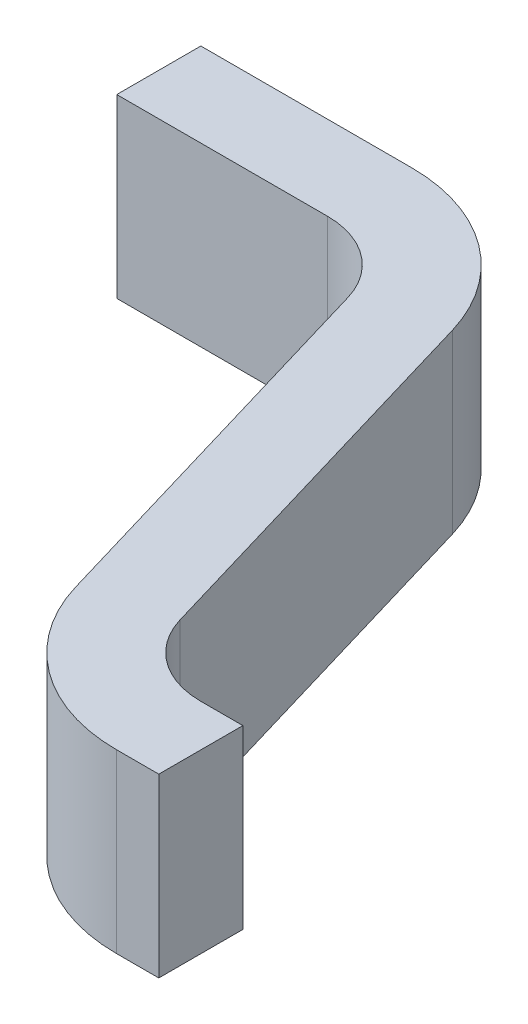
ISO-10303-21;
HEADER;
FILE_DESCRIPTION(('STEP AP214'),'2;1');
FILE_NAME('part.step','',(''),(''),'','','');
FILE_SCHEMA(('AUTOMOTIVE_DESIGN { 1 0 10303 214 1 1 1 1 }'));
ENDSEC;
DATA;
#1=APPLICATION_CONTEXT('core data for automotive mechanical design processes');
#2=APPLICATION_PROTOCOL_DEFINITION('international standard','automotive_design',2000,#1);
#3=PRODUCT_CONTEXT('',#1,'mechanical');
#4=PRODUCT('Part','Part','',(#3));
#5=PRODUCT_RELATED_PRODUCT_CATEGORY('part','',(#4));
#6=PRODUCT_DEFINITION_FORMATION('','',#4);
#7=PRODUCT_DEFINITION_CONTEXT('part definition',#1,'design');
#8=PRODUCT_DEFINITION('design','',#6,#7);
#9=PRODUCT_DEFINITION_SHAPE('','',#8);
#10=(LENGTH_UNIT() NAMED_UNIT(*) SI_UNIT(.MILLI.,.METRE.));
#11=(NAMED_UNIT(*) PLANE_ANGLE_UNIT() SI_UNIT($,.RADIAN.));
#12=(NAMED_UNIT(*) SI_UNIT($,.STERADIAN.) SOLID_ANGLE_UNIT());
#13=UNCERTAINTY_MEASURE_WITH_UNIT(LENGTH_MEASURE(1.E-05),#10,'distance_accuracy_value','');
#14=(GEOMETRIC_REPRESENTATION_CONTEXT(3) GLOBAL_UNCERTAINTY_ASSIGNED_CONTEXT((#13)) GLOBAL_UNIT_ASSIGNED_CONTEXT((#10,
#11,#12)) REPRESENTATION_CONTEXT('',''));
#15=CARTESIAN_POINT('',(0.,0.,0.));
#16=DIRECTION('',(0.,0.,1.));
#17=DIRECTION('',(1.,0.,0.));
#18=AXIS2_PLACEMENT_3D('',#15,#16,#17);
#19=CARTESIAN_POINT('',(-4.400000005961,4.235000006557,0.));
#20=DIRECTION('',(0.,-1.,0.));
#21=DIRECTION('',(0.,0.,-1.));
#22=AXIS2_PLACEMENT_3D('',#19,#20,#21);
#23=PLANE('',#22);
#24=DIRECTION('',(1.,0.,0.));
#25=VECTOR('',#24,1.);
#26=CARTESIAN_POINT('',(-4.150000005961,4.235000006557,1.35));
#27=LINE('',#26,#25);
#28=CARTESIAN_POINT('',(-3.850765250213,4.235000006557,1.35));
#29=VERTEX_POINT('',#28);
#30=CARTESIAN_POINT('',(-3.750000000001,4.235000006557,1.35));
#31=VERTEX_POINT('',#30);
#32=EDGE_CURVE('E128',#29,#31,#27,.T.);
#33=ORIENTED_EDGE('',*,*,#32,.T.);
#34=DIRECTION('',(0.,0.,-1.));
#35=VECTOR('',#34,1.);
#36=CARTESIAN_POINT('',(-3.750000000001,4.235000006557,1.35));
#37=LINE('',#36,#35);
#38=CARTESIAN_POINT('',(-3.750000000001,4.235000006557,1.55000000298));
#39=VERTEX_POINT('',#38);
#40=EDGE_CURVE('E132',#39,#31,#37,.T.);
#41=ORIENTED_EDGE('',*,*,#40,.F.);
#42=DIRECTION('',(1.,0.,0.));
#43=VECTOR('',#42,1.);
#44=CARTESIAN_POINT('',(-4.150000005961,4.235000006557,1.55000000298));
#45=LINE('',#44,#43);
#46=CARTESIAN_POINT('',(-3.850765252438,4.235000006557,1.55000000298));
#47=VERTEX_POINT('',#46);
#48=EDGE_CURVE('E135',#47,#39,#45,.T.);
#49=ORIENTED_EDGE('',*,*,#48,.F.);
#50=CARTESIAN_POINT('',(-3.850765252438,4.235000006557,1.15000000298));
#51=DIRECTION('',(0.,1.,0.));
#52=DIRECTION('',(1.,0.,0.));
#53=AXIS2_PLACEMENT_3D('',#50,#51,#52);
#54=CIRCLE('',#53,0.4);
#55=CARTESIAN_POINT('',(-4.23429319364,4.235000006557,1.263605981335));
#56=VERTEX_POINT('',#55);
#57=EDGE_CURVE('E158',#56,#47,#54,.T.);
#58=ORIENTED_EDGE('',*,*,#57,.F.);
#59=DIRECTION('',(0.284014945887016,0.,0.958819853003053));
#60=VECTOR('',#59,1.);
#61=CARTESIAN_POINT('',(-4.591763979419,4.235000006557,0.0568029900239));
#62=LINE('',#61,#60);
#63=CARTESIAN_POINT('',(-4.506930334275,4.235000006557,0.343197013803));
#64=VERTEX_POINT('',#63);
#65=EDGE_CURVE('E162',#64,#56,#62,.T.);
#66=ORIENTED_EDGE('',*,*,#65,.F.);
#67=CARTESIAN_POINT('',(-4.698694304876,4.235000006557,0.40000000298));
#68=DIRECTION('',(0.,1.,0.));
#69=DIRECTION('',(-1.,0.,0.));
#70=AXIS2_PLACEMENT_3D('',#67,#68,#69);
#71=CIRCLE('',#70,0.2);
#72=CARTESIAN_POINT('',(-4.698694304876,4.235000006557,0.20000000298));
#73=VERTEX_POINT('',#72);
#74=EDGE_CURVE('E11',#64,#73,#71,.T.);
#75=ORIENTED_EDGE('',*,*,#74,.T.);
#76=DIRECTION('',(1.,0.,0.));
#77=VECTOR('',#76,1.);
#78=CARTESIAN_POINT('',(-5.20000000596,4.235000006557,0.20000000298));
#79=LINE('',#78,#77);
#80=CARTESIAN_POINT('',(-5.20000000596,4.235000006557,0.20000000298));
#81=VERTEX_POINT('',#80);
#82=EDGE_CURVE('E187',#81,#73,#79,.T.);
#83=ORIENTED_EDGE('',*,*,#82,.F.);
#84=DIRECTION('',(0.,0.,-1.));
#85=VECTOR('',#84,1.);
#86=CARTESIAN_POINT('',(-5.20000000596,4.235000006557,0.));
#87=LINE('',#86,#85);
#88=CARTESIAN_POINT('',(-5.20000000596,4.235000006557,0.));
#89=VERTEX_POINT('',#88);
#90=EDGE_CURVE('E181',#81,#89,#87,.T.);
#91=ORIENTED_EDGE('',*,*,#90,.T.);
#92=DIRECTION('',(1.,0.,0.));
#93=VECTOR('',#92,1.);
#94=CARTESIAN_POINT('',(-5.20000000596,4.235000006557,0.));
#95=LINE('',#94,#93);
#96=CARTESIAN_POINT('',(-4.698694302651,4.235000006557,0.));
#97=VERTEX_POINT('',#96);
#98=EDGE_CURVE('E182',#89,#97,#95,.T.);
#99=ORIENTED_EDGE('',*,*,#98,.T.);
#100=CARTESIAN_POINT('',(-4.698694302651,4.235000006557,0.4));
#101=DIRECTION('',(0.,1.,0.));
#102=DIRECTION('',(1.,0.,0.));
#103=AXIS2_PLACEMENT_3D('',#100,#101,#102);
#104=CIRCLE('',#103,0.4);
#105=CARTESIAN_POINT('',(-4.315166361449,4.235000006557,0.286394021645));
#106=VERTEX_POINT('',#105);
#107=EDGE_CURVE('E208',#106,#97,#104,.T.);
#108=ORIENTED_EDGE('',*,*,#107,.F.);
#109=DIRECTION('',(0.284014945887016,0.,0.958819853003053));
#110=VECTOR('',#109,1.);
#111=CARTESIAN_POINT('',(-4.400000005961,4.235000006557,0.));
#112=LINE('',#111,#110);
#113=CARTESIAN_POINT('',(-4.042529220814,4.235000006557,1.206802989177));
#114=VERTEX_POINT('',#113);
#115=EDGE_CURVE('E20',#106,#114,#112,.T.);
#116=ORIENTED_EDGE('',*,*,#115,.T.);
#117=CARTESIAN_POINT('',(-3.850765250213,4.235000006557,1.15));
#118=DIRECTION('',(0.,1.,0.));
#119=DIRECTION('',(1.,0.,0.));
#120=AXIS2_PLACEMENT_3D('',#117,#118,#119);
#121=CIRCLE('',#120,0.2);
#122=EDGE_CURVE('E312',#114,#29,#121,.T.);
#123=ORIENTED_EDGE('',*,*,#122,.T.);
#124=EDGE_LOOP('',(#33,#41,#49,#58,#66,#75,#83,#91,#99,#108,#116,#123));
#125=FACE_BOUND('',#124,.T.);
#126=ADVANCED_FACE('F16',(#125),#23,.T.);
#127=CARTESIAN_POINT('',(-4.698694304876,4.654999993444,0.40000000298));
#128=DIRECTION('',(0.,1.,0.));
#129=DIRECTION('',(-1.,0.,0.));
#130=AXIS2_PLACEMENT_3D('',#127,#128,#129);
#131=CYLINDRICAL_SURFACE('',#130,0.2);
#132=DIRECTION('',(0.,1.,0.));
#133=VECTOR('',#132,1.);
#134=CARTESIAN_POINT('',(-4.698694304876,4.654999993444,0.20000000298));
#135=LINE('',#134,#133);
#136=CARTESIAN_POINT('',(-4.698694304876,4.654999993444,0.20000000298));
#137=VERTEX_POINT('',#136);
#138=EDGE_CURVE('E27',#73,#137,#135,.T.);
#139=ORIENTED_EDGE('',*,*,#138,.F.);
#140=ORIENTED_EDGE('',*,*,#74,.F.);
#141=DIRECTION('',(0.,-1.,0.));
#142=VECTOR('',#141,1.);
#143=CARTESIAN_POINT('',(-4.506930334275,4.654999993444,0.343197013803));
#144=LINE('',#143,#142);
#145=CARTESIAN_POINT('',(-4.506930334275,4.654999993444,0.343197013803));
#146=VERTEX_POINT('',#145);
#147=EDGE_CURVE('E191',#146,#64,#144,.T.);
#148=ORIENTED_EDGE('',*,*,#147,.F.);
#149=CARTESIAN_POINT('',(-4.698694304876,4.654999993444,0.40000000298));
#150=DIRECTION('',(0.,1.,0.));
#151=DIRECTION('',(-1.,0.,0.));
#152=AXIS2_PLACEMENT_3D('',#149,#150,#151);
#153=CIRCLE('',#152,0.2);
#154=EDGE_CURVE('E192',#146,#137,#153,.T.);
#155=ORIENTED_EDGE('',*,*,#154,.T.);
#156=EDGE_LOOP('',(#139,#140,#148,#155));
#157=FACE_BOUND('',#156,.T.);
#158=ADVANCED_FACE('F463',(#157),#131,.F.);
#159=CARTESIAN_POINT('',(-5.20000000596,4.654999993444,0.20000000298));
#160=DIRECTION('',(0.,0.,1.));
#161=DIRECTION('',(1.,0.,0.));
#162=AXIS2_PLACEMENT_3D('',#159,#160,#161);
#163=PLANE('',#162);
#164=DIRECTION('',(-1.,0.,0.));
#165=VECTOR('',#164,1.);
#166=CARTESIAN_POINT('',(-4.400000005961,4.654999993444,0.20000000298));
#167=LINE('',#166,#165);
#168=CARTESIAN_POINT('',(-5.20000000596,4.654999993444,0.20000000298));
#169=VERTEX_POINT('',#168);
#170=EDGE_CURVE('E175',#137,#169,#167,.T.);
#171=ORIENTED_EDGE('',*,*,#170,.T.);
#172=DIRECTION('',(0.,-1.,0.));
#173=VECTOR('',#172,1.);
#174=CARTESIAN_POINT('',(-5.20000000596,4.654999993444,0.20000000298));
#175=LINE('',#174,#173);
#176=EDGE_CURVE('E183',#169,#81,#175,.T.);
#177=ORIENTED_EDGE('',*,*,#176,.T.);
#178=ORIENTED_EDGE('',*,*,#82,.T.);
#179=ORIENTED_EDGE('',*,*,#138,.T.);
#180=EDGE_LOOP('',(#171,#177,#178,#179));
#181=FACE_BOUND('',#180,.T.);
#182=ADVANCED_FACE('F413',(#181),#163,.T.);
#183=CARTESIAN_POINT('',(-5.20000000596,4.654999993444,0.));
#184=DIRECTION('',(1.,0.,0.));
#185=DIRECTION('',(0.,1.,0.));
#186=AXIS2_PLACEMENT_3D('',#183,#184,#185);
#187=PLANE('',#186);
#188=DIRECTION('',(0.,0.,-1.));
#189=VECTOR('',#188,1.);
#190=CARTESIAN_POINT('',(-5.20000000596,4.654999993444,0.));
#191=LINE('',#190,#189);
#192=CARTESIAN_POINT('',(-5.20000000596,4.654999993444,0.));
#193=VERTEX_POINT('',#192);
#194=EDGE_CURVE('E167',#169,#193,#191,.T.);
#195=ORIENTED_EDGE('',*,*,#194,.T.);
#196=DIRECTION('',(0.,-1.,0.));
#197=VECTOR('',#196,1.);
#198=CARTESIAN_POINT('',(-5.20000000596,4.654999993444,0.));
#199=LINE('',#198,#197);
#200=EDGE_CURVE('E177',#193,#89,#199,.T.);
#201=ORIENTED_EDGE('',*,*,#200,.T.);
#202=ORIENTED_EDGE('',*,*,#90,.F.);
#203=ORIENTED_EDGE('',*,*,#176,.F.);
#204=EDGE_LOOP('',(#195,#201,#202,#203));
#205=FACE_BOUND('',#204,.T.);
#206=ADVANCED_FACE('F18',(#205),#187,.F.);
#207=CARTESIAN_POINT('',(-5.20000000596,4.654999993444,0.));
#208=DIRECTION('',(0.,0.,1.));
#209=DIRECTION('',(1.,0.,0.));
#210=AXIS2_PLACEMENT_3D('',#207,#208,#209);
#211=PLANE('',#210);
#212=DIRECTION('',(0.,1.,0.));
#213=VECTOR('',#212,1.);
#214=CARTESIAN_POINT('',(-4.698694302651,4.654999993444,0.));
#215=LINE('',#214,#213);
#216=CARTESIAN_POINT('',(-4.698694302651,4.654999993444,0.));
#217=VERTEX_POINT('',#216);
#218=EDGE_CURVE('E224',#97,#217,#215,.T.);
#219=ORIENTED_EDGE('',*,*,#218,.F.);
#220=ORIENTED_EDGE('',*,*,#98,.F.);
#221=ORIENTED_EDGE('',*,*,#200,.F.);
#222=DIRECTION('',(1.,0.,0.));
#223=VECTOR('',#222,1.);
#224=CARTESIAN_POINT('',(-4.400000005961,4.654999993444,0.));
#225=LINE('',#224,#223);
#226=EDGE_CURVE('E164',#193,#217,#225,.T.);
#227=ORIENTED_EDGE('',*,*,#226,.T.);
#228=EDGE_LOOP('',(#219,#220,#221,#227));
#229=FACE_BOUND('',#228,.T.);
#230=ADVANCED_FACE('F265',(#229),#211,.F.);
#231=CARTESIAN_POINT('',(-4.698694302651,4.654999993444,0.4));
#232=DIRECTION('',(0.,-1.,0.));
#233=DIRECTION('',(1.,0.,0.));
#234=AXIS2_PLACEMENT_3D('',#231,#232,#233);
#235=CYLINDRICAL_SURFACE('',#234,0.4);
#236=ORIENTED_EDGE('',*,*,#107,.T.);
#237=ORIENTED_EDGE('',*,*,#218,.T.);
#238=CARTESIAN_POINT('',(-4.698694302651,4.654999993444,0.4));
#239=DIRECTION('',(0.,-1.,0.));
#240=DIRECTION('',(1.,0.,0.));
#241=AXIS2_PLACEMENT_3D('',#238,#239,#240);
#242=CIRCLE('',#241,0.4);
#243=CARTESIAN_POINT('',(-4.315166361449,4.654999993444,0.286394021645));
#244=VERTEX_POINT('',#243);
#245=EDGE_CURVE('E168',#217,#244,#242,.T.);
#246=ORIENTED_EDGE('',*,*,#245,.T.);
#247=DIRECTION('',(0.,-1.,0.));
#248=VECTOR('',#247,1.);
#249=CARTESIAN_POINT('',(-4.315166361449,4.654999993444,0.286394021645));
#250=LINE('',#249,#248);
#251=EDGE_CURVE('E205',#244,#106,#250,.T.);
#252=ORIENTED_EDGE('',*,*,#251,.T.);
#253=EDGE_LOOP('',(#236,#237,#246,#252));
#254=FACE_BOUND('',#253,.T.);
#255=ADVANCED_FACE('F307',(#254),#235,.T.);
#256=CARTESIAN_POINT('',(-4.400000005961,4.654999993444,0.));
#257=DIRECTION('',(-0.958819853003053,0.,0.284014945887016));
#258=DIRECTION('',(0.,1.,0.));
#259=AXIS2_PLACEMENT_3D('',#256,#257,#258);
#260=PLANE('',#259);
#261=DIRECTION('',(0.,-1.,0.));
#262=VECTOR('',#261,1.);
#263=CARTESIAN_POINT('',(-4.042529220814,4.654999993444,1.206802989177));
#264=LINE('',#263,#262);
#265=CARTESIAN_POINT('',(-4.042529220814,4.654999993444,1.206802989177));
#266=VERTEX_POINT('',#265);
#267=EDGE_CURVE('E172',#266,#114,#264,.T.);
#268=ORIENTED_EDGE('',*,*,#267,.T.);
#269=ORIENTED_EDGE('',*,*,#115,.F.);
#270=ORIENTED_EDGE('',*,*,#251,.F.);
#271=DIRECTION('',(0.284014945887016,0.,0.958819853003053));
#272=VECTOR('',#271,1.);
#273=CARTESIAN_POINT('',(-4.315166361449,4.654999993444,0.286394021645));
#274=LINE('',#273,#272);
#275=EDGE_CURVE('E199',#244,#266,#274,.T.);
#276=ORIENTED_EDGE('',*,*,#275,.T.);
#277=EDGE_LOOP('',(#268,#269,#270,#276));
#278=FACE_BOUND('',#277,.T.);
#279=ADVANCED_FACE('F303',(#278),#260,.F.);
#280=CARTESIAN_POINT('',(-3.850765250213,4.654999993444,1.15));
#281=DIRECTION('',(0.,-1.,0.));
#282=DIRECTION('',(1.,0.,0.));
#283=AXIS2_PLACEMENT_3D('',#280,#281,#282);
#284=CYLINDRICAL_SURFACE('',#283,0.2);
#285=ORIENTED_EDGE('',*,*,#267,.F.);
#286=CARTESIAN_POINT('',(-3.850765250213,4.654999993444,1.15));
#287=DIRECTION('',(0.,1.,0.));
#288=DIRECTION('',(1.,0.,0.));
#289=AXIS2_PLACEMENT_3D('',#286,#287,#288);
#290=CIRCLE('',#289,0.2);
#291=CARTESIAN_POINT('',(-3.850765250213,4.654999993444,1.35));
#292=VERTEX_POINT('',#291);
#293=EDGE_CURVE('E204',#266,#292,#290,.T.);
#294=ORIENTED_EDGE('',*,*,#293,.T.);
#295=DIRECTION('',(0.,-1.,0.));
#296=VECTOR('',#295,1.);
#297=CARTESIAN_POINT('',(-3.850765250213,4.654999993444,1.35));
#298=LINE('',#297,#296);
#299=EDGE_CURVE('E139',#292,#29,#298,.T.);
#300=ORIENTED_EDGE('',*,*,#299,.T.);
#301=ORIENTED_EDGE('',*,*,#122,.F.);
#302=EDGE_LOOP('',(#285,#294,#300,#301));
#303=FACE_BOUND('',#302,.T.);
#304=ADVANCED_FACE('F310',(#303),#284,.F.);
#305=CARTESIAN_POINT('',(-4.150000005961,4.654999993444,1.35));
#306=DIRECTION('',(0.,0.,1.));
#307=DIRECTION('',(1.,0.,0.));
#308=AXIS2_PLACEMENT_3D('',#305,#306,#307);
#309=PLANE('',#308);
#310=ORIENTED_EDGE('',*,*,#299,.F.);
#311=DIRECTION('',(1.,0.,0.));
#312=VECTOR('',#311,1.);
#313=CARTESIAN_POINT('',(-4.400000005961,4.654999993444,1.35));
#314=LINE('',#313,#312);
#315=CARTESIAN_POINT('',(-3.750000000001,4.654999993444,1.35));
#316=VERTEX_POINT('',#315);
#317=EDGE_CURVE('E200',#292,#316,#314,.T.);
#318=ORIENTED_EDGE('',*,*,#317,.T.);
#319=DIRECTION('',(0.,1.,0.));
#320=VECTOR('',#319,1.);
#321=CARTESIAN_POINT('',(-3.750000000001,4.654999993444,1.35));
#322=LINE('',#321,#320);
#323=EDGE_CURVE('E140',#31,#316,#322,.T.);
#324=ORIENTED_EDGE('',*,*,#323,.F.);
#325=ORIENTED_EDGE('',*,*,#32,.F.);
#326=EDGE_LOOP('',(#310,#318,#324,#325));
#327=FACE_BOUND('',#326,.T.);
#328=ADVANCED_FACE('F433',(#327),#309,.F.);
#329=CARTESIAN_POINT('',(-3.750000000001,4.654999993444,1.35));
#330=DIRECTION('',(1.,0.,0.));
#331=DIRECTION('',(0.,1.,0.));
#332=AXIS2_PLACEMENT_3D('',#329,#330,#331);
#333=PLANE('',#332);
#334=ORIENTED_EDGE('',*,*,#323,.T.);
#335=DIRECTION('',(0.,0.,1.));
#336=VECTOR('',#335,1.);
#337=CARTESIAN_POINT('',(-3.750000000001,4.654999993444,0.));
#338=LINE('',#337,#336);
#339=CARTESIAN_POINT('',(-3.750000000001,4.654999993444,1.55000000298));
#340=VERTEX_POINT('',#339);
#341=EDGE_CURVE('E146',#316,#340,#338,.T.);
#342=ORIENTED_EDGE('',*,*,#341,.T.);
#343=DIRECTION('',(0.,1.,0.));
#344=VECTOR('',#343,1.);
#345=CARTESIAN_POINT('',(-3.750000000001,4.654999993444,1.55000000298));
#346=LINE('',#345,#344);
#347=EDGE_CURVE('E143',#39,#340,#346,.T.);
#348=ORIENTED_EDGE('',*,*,#347,.F.);
#349=ORIENTED_EDGE('',*,*,#40,.T.);
#350=EDGE_LOOP('',(#334,#342,#348,#349));
#351=FACE_BOUND('',#350,.T.);
#352=ADVANCED_FACE('F144',(#351),#333,.T.);
#353=CARTESIAN_POINT('',(-4.150000005961,4.654999993444,1.55000000298));
#354=DIRECTION('',(0.,0.,1.));
#355=DIRECTION('',(1.,0.,0.));
#356=AXIS2_PLACEMENT_3D('',#353,#354,#355);
#357=PLANE('',#356);
#358=ORIENTED_EDGE('',*,*,#48,.T.);
#359=ORIENTED_EDGE('',*,*,#347,.T.);
#360=DIRECTION('',(-1.,0.,0.));
#361=VECTOR('',#360,1.);
#362=CARTESIAN_POINT('',(-4.400000005961,4.654999993444,1.55000000298));
#363=LINE('',#362,#361);
#364=CARTESIAN_POINT('',(-3.850765252438,4.654999993444,1.55000000298));
#365=VERTEX_POINT('',#364);
#366=EDGE_CURVE('E216',#340,#365,#363,.T.);
#367=ORIENTED_EDGE('',*,*,#366,.T.);
#368=DIRECTION('',(0.,1.,0.));
#369=VECTOR('',#368,1.);
#370=CARTESIAN_POINT('',(-3.850765252438,4.654999993444,1.55000000298));
#371=LINE('',#370,#369);
#372=EDGE_CURVE('E92',#47,#365,#371,.T.);
#373=ORIENTED_EDGE('',*,*,#372,.F.);
#374=EDGE_LOOP('',(#358,#359,#367,#373));
#375=FACE_BOUND('',#374,.T.);
#376=ADVANCED_FACE('F151',(#375),#357,.T.);
#377=CARTESIAN_POINT('',(-3.850765252438,4.654999993444,1.15000000298));
#378=DIRECTION('',(0.,-1.,0.));
#379=DIRECTION('',(1.,0.,0.));
#380=AXIS2_PLACEMENT_3D('',#377,#378,#379);
#381=CYLINDRICAL_SURFACE('',#380,0.4);
#382=ORIENTED_EDGE('',*,*,#57,.T.);
#383=ORIENTED_EDGE('',*,*,#372,.T.);
#384=CARTESIAN_POINT('',(-3.850765252438,4.654999993444,1.15000000298));
#385=DIRECTION('',(0.,-1.,0.));
#386=DIRECTION('',(1.,0.,0.));
#387=AXIS2_PLACEMENT_3D('',#384,#385,#386);
#388=CIRCLE('',#387,0.4);
#389=CARTESIAN_POINT('',(-4.234293193639,4.654999993444,1.263605981335));
#390=VERTEX_POINT('',#389);
#391=EDGE_CURVE('E213',#365,#390,#388,.T.);
#392=ORIENTED_EDGE('',*,*,#391,.T.);
#393=DIRECTION('',(0.,1.,0.));
#394=VECTOR('',#393,1.);
#395=CARTESIAN_POINT('',(-4.23429319364,4.654999993444,1.263605981335));
#396=LINE('',#395,#394);
#397=EDGE_CURVE('E77',#56,#390,#396,.T.);
#398=ORIENTED_EDGE('',*,*,#397,.F.);
#399=EDGE_LOOP('',(#382,#383,#392,#398));
#400=FACE_BOUND('',#399,.T.);
#401=ADVANCED_FACE('F280',(#400),#381,.T.);
#402=CARTESIAN_POINT('',(-4.591763979419,4.654999993444,0.0568029900239));
#403=DIRECTION('',(-0.958819853003053,0.,0.284014945887016));
#404=DIRECTION('',(0.,1.,0.));
#405=AXIS2_PLACEMENT_3D('',#402,#403,#404);
#406=PLANE('',#405);
#407=DIRECTION('',(-0.284014945887016,0.,-0.958819853003053));
#408=VECTOR('',#407,1.);
#409=CARTESIAN_POINT('',(-4.234293193639,4.654999993444,1.263605981335));
#410=LINE('',#409,#408);
#411=EDGE_CURVE('E188',#390,#146,#410,.T.);
#412=ORIENTED_EDGE('',*,*,#411,.T.);
#413=ORIENTED_EDGE('',*,*,#147,.T.);
#414=ORIENTED_EDGE('',*,*,#65,.T.);
#415=ORIENTED_EDGE('',*,*,#397,.T.);
#416=EDGE_LOOP('',(#412,#413,#414,#415));
#417=FACE_BOUND('',#416,.T.);
#418=ADVANCED_FACE('F279',(#417),#406,.T.);
#419=CARTESIAN_POINT('',(-4.400000005961,4.654999993444,0.));
#420=DIRECTION('',(0.,-1.,0.));
#421=DIRECTION('',(0.,0.,-1.));
#422=AXIS2_PLACEMENT_3D('',#419,#420,#421);
#423=PLANE('',#422);
#424=ORIENTED_EDGE('',*,*,#391,.F.);
#425=ORIENTED_EDGE('',*,*,#366,.F.);
#426=ORIENTED_EDGE('',*,*,#341,.F.);
#427=ORIENTED_EDGE('',*,*,#317,.F.);
#428=ORIENTED_EDGE('',*,*,#293,.F.);
#429=ORIENTED_EDGE('',*,*,#275,.F.);
#430=ORIENTED_EDGE('',*,*,#245,.F.);
#431=ORIENTED_EDGE('',*,*,#226,.F.);
#432=ORIENTED_EDGE('',*,*,#194,.F.);
#433=ORIENTED_EDGE('',*,*,#170,.F.);
#434=ORIENTED_EDGE('',*,*,#154,.F.);
#435=ORIENTED_EDGE('',*,*,#411,.F.);
#436=EDGE_LOOP('',(#424,#425,#426,#427,#428,#429,#430,#431,#432,#433,#434,#435));
#437=FACE_BOUND('',#436,.T.);
#438=ADVANCED_FACE('F283',(#437),#423,.F.);
#439=CLOSED_SHELL('',(#126,#158,#182,#206,#230,#255,#279,#304,#328,#352,#376,#401,#418,#438));
#440=MANIFOLD_SOLID_BREP('B1',#439);
#441=ADVANCED_BREP_SHAPE_REPRESENTATION('',(#18,#440),#14);
#442=SHAPE_DEFINITION_REPRESENTATION(#9,#441);
ENDSEC;
END-ISO-10303-21;
